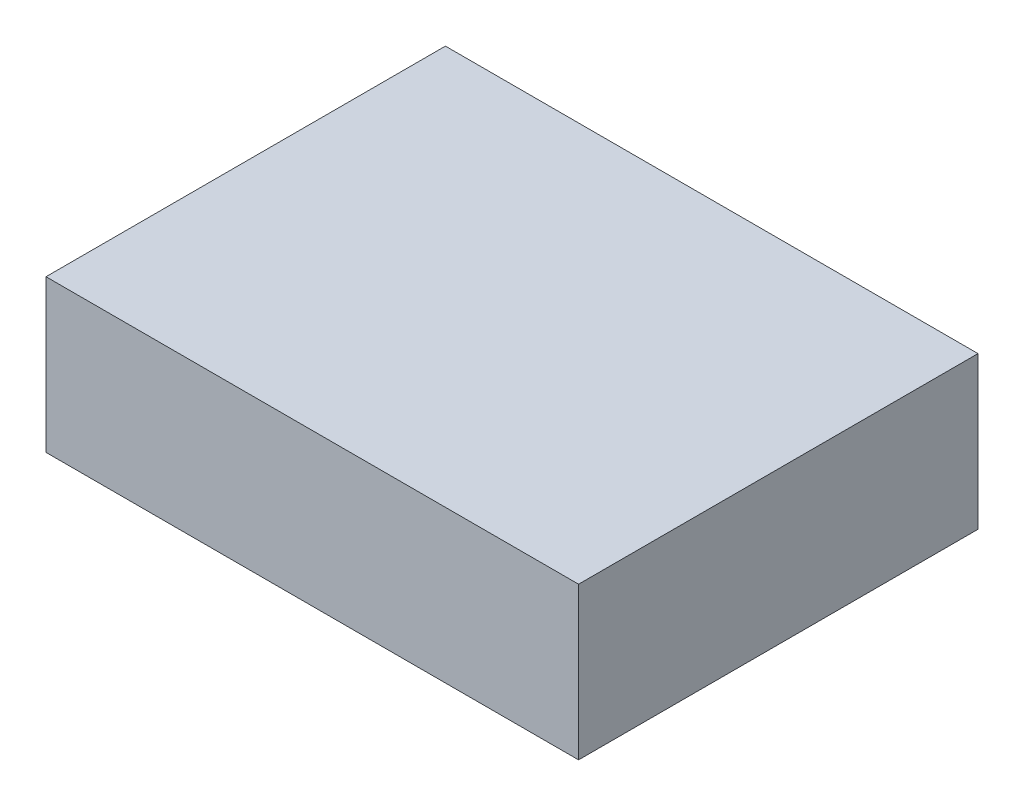
ISO-10303-21;
HEADER;
FILE_DESCRIPTION(('STEP AP214'),'2;1');
FILE_NAME('part.step','',(''),(''),'','','');
FILE_SCHEMA(('AUTOMOTIVE_DESIGN { 1 0 10303 214 1 1 1 1 }'));
ENDSEC;
DATA;
#1=APPLICATION_CONTEXT('core data for automotive mechanical design processes');
#2=APPLICATION_PROTOCOL_DEFINITION('international standard','automotive_design',2000,#1);
#3=PRODUCT_CONTEXT('',#1,'mechanical');
#4=PRODUCT('Part','Part','',(#3));
#5=PRODUCT_RELATED_PRODUCT_CATEGORY('part','',(#4));
#6=PRODUCT_DEFINITION_FORMATION('','',#4);
#7=PRODUCT_DEFINITION_CONTEXT('part definition',#1,'design');
#8=PRODUCT_DEFINITION('design','',#6,#7);
#9=PRODUCT_DEFINITION_SHAPE('','',#8);
#10=(LENGTH_UNIT() NAMED_UNIT(*) SI_UNIT(.MILLI.,.METRE.));
#11=(NAMED_UNIT(*) PLANE_ANGLE_UNIT() SI_UNIT($,.RADIAN.));
#12=(NAMED_UNIT(*) SI_UNIT($,.STERADIAN.) SOLID_ANGLE_UNIT());
#13=UNCERTAINTY_MEASURE_WITH_UNIT(LENGTH_MEASURE(1.E-05),#10,'distance_accuracy_value','');
#14=(GEOMETRIC_REPRESENTATION_CONTEXT(3) GLOBAL_UNCERTAINTY_ASSIGNED_CONTEXT((#13)) GLOBAL_UNIT_ASSIGNED_CONTEXT((#10,
#11,#12)) REPRESENTATION_CONTEXT('',''));
#15=CARTESIAN_POINT('',(0.,0.,0.));
#16=DIRECTION('',(0.,0.,1.));
#17=DIRECTION('',(1.,0.,0.));
#18=AXIS2_PLACEMENT_3D('',#15,#16,#17);
#19=CARTESIAN_POINT('',(0.,25.4,0.));
#20=DIRECTION('',(1.,0.,0.));
#21=DIRECTION('',(0.,0.,-1.));
#22=AXIS2_PLACEMENT_3D('',#19,#20,#21);
#23=PLANE('',#22);
#24=DIRECTION('',(0.,0.,1.));
#25=VECTOR('',#24,1.);
#26=CARTESIAN_POINT('',(0.,0.,0.));
#27=LINE('',#26,#25);
#28=CARTESIAN_POINT('',(0.,0.,-66.675));
#29=VERTEX_POINT('',#28);
#30=CARTESIAN_POINT('',(0.,0.,0.));
#31=VERTEX_POINT('',#30);
#32=EDGE_CURVE('E96',#29,#31,#27,.T.);
#33=ORIENTED_EDGE('',*,*,#32,.T.);
#34=DIRECTION('',(0.,-1.,0.));
#35=VECTOR('',#34,1.);
#36=CARTESIAN_POINT('',(0.,25.4,0.));
#37=LINE('',#36,#35);
#38=CARTESIAN_POINT('',(0.,25.4,0.));
#39=VERTEX_POINT('',#38);
#40=EDGE_CURVE('E11',#39,#31,#37,.T.);
#41=ORIENTED_EDGE('',*,*,#40,.F.);
#42=DIRECTION('',(0.,0.,1.));
#43=VECTOR('',#42,1.);
#44=CARTESIAN_POINT('',(0.,25.4,0.));
#45=LINE('',#44,#43);
#46=CARTESIAN_POINT('',(0.,25.4,-66.675));
#47=VERTEX_POINT('',#46);
#48=EDGE_CURVE('E84',#47,#39,#45,.T.);
#49=ORIENTED_EDGE('',*,*,#48,.F.);
#50=DIRECTION('',(0.,-1.,0.));
#51=VECTOR('',#50,1.);
#52=CARTESIAN_POINT('',(0.,25.4,-66.675));
#53=LINE('',#52,#51);
#54=EDGE_CURVE('E92',#47,#29,#53,.T.);
#55=ORIENTED_EDGE('',*,*,#54,.T.);
#56=EDGE_LOOP('',(#33,#41,#49,#55));
#57=FACE_BOUND('',#56,.T.);
#58=ADVANCED_FACE('F33',(#57),#23,.F.);
#59=CARTESIAN_POINT('',(0.,25.4,0.));
#60=DIRECTION('',(0.,0.,-1.));
#61=DIRECTION('',(-1.,0.,0.));
#62=AXIS2_PLACEMENT_3D('',#59,#60,#61);
#63=PLANE('',#62);
#64=DIRECTION('',(1.,0.,0.));
#65=VECTOR('',#64,1.);
#66=CARTESIAN_POINT('',(0.,0.,0.));
#67=LINE('',#66,#65);
#68=CARTESIAN_POINT('',(88.9,0.,0.));
#69=VERTEX_POINT('',#68);
#70=EDGE_CURVE('E88',#31,#69,#67,.T.);
#71=ORIENTED_EDGE('',*,*,#70,.T.);
#72=DIRECTION('',(0.,-1.,0.));
#73=VECTOR('',#72,1.);
#74=CARTESIAN_POINT('',(88.9,25.4,0.));
#75=LINE('',#74,#73);
#76=CARTESIAN_POINT('',(88.9,25.4,0.));
#77=VERTEX_POINT('',#76);
#78=EDGE_CURVE('E41',#77,#69,#75,.T.);
#79=ORIENTED_EDGE('',*,*,#78,.F.);
#80=DIRECTION('',(1.,0.,0.));
#81=VECTOR('',#80,1.);
#82=CARTESIAN_POINT('',(0.,25.4,0.));
#83=LINE('',#82,#81);
#84=EDGE_CURVE('E79',#39,#77,#83,.T.);
#85=ORIENTED_EDGE('',*,*,#84,.F.);
#86=ORIENTED_EDGE('',*,*,#40,.T.);
#87=EDGE_LOOP('',(#71,#79,#85,#86));
#88=FACE_BOUND('',#87,.T.);
#89=ADVANCED_FACE('F87',(#88),#63,.F.);
#90=CARTESIAN_POINT('',(88.9,25.4,0.));
#91=DIRECTION('',(-1.,0.,0.));
#92=DIRECTION('',(0.,0.,1.));
#93=AXIS2_PLACEMENT_3D('',#90,#91,#92);
#94=PLANE('',#93);
#95=DIRECTION('',(0.,0.,-1.));
#96=VECTOR('',#95,1.);
#97=CARTESIAN_POINT('',(88.9,0.,0.));
#98=LINE('',#97,#96);
#99=CARTESIAN_POINT('',(88.9,0.,-66.675));
#100=VERTEX_POINT('',#99);
#101=EDGE_CURVE('E66',#69,#100,#98,.T.);
#102=ORIENTED_EDGE('',*,*,#101,.T.);
#103=DIRECTION('',(0.,-1.,0.));
#104=VECTOR('',#103,1.);
#105=CARTESIAN_POINT('',(88.9,25.4,-66.675));
#106=LINE('',#105,#104);
#107=CARTESIAN_POINT('',(88.9,25.4,-66.675));
#108=VERTEX_POINT('',#107);
#109=EDGE_CURVE('E89',#108,#100,#106,.T.);
#110=ORIENTED_EDGE('',*,*,#109,.F.);
#111=DIRECTION('',(0.,0.,-1.));
#112=VECTOR('',#111,1.);
#113=CARTESIAN_POINT('',(88.9,25.4,0.));
#114=LINE('',#113,#112);
#115=EDGE_CURVE('E82',#77,#108,#114,.T.);
#116=ORIENTED_EDGE('',*,*,#115,.F.);
#117=ORIENTED_EDGE('',*,*,#78,.T.);
#118=EDGE_LOOP('',(#102,#110,#116,#117));
#119=FACE_BOUND('',#118,.T.);
#120=ADVANCED_FACE('F90',(#119),#94,.F.);
#121=CARTESIAN_POINT('',(0.,25.4,-66.675));
#122=DIRECTION('',(0.,0.,1.));
#123=DIRECTION('',(1.,0.,0.));
#124=AXIS2_PLACEMENT_3D('',#121,#122,#123);
#125=PLANE('',#124);
#126=DIRECTION('',(-1.,0.,0.));
#127=VECTOR('',#126,1.);
#128=CARTESIAN_POINT('',(0.,0.,-66.675));
#129=LINE('',#128,#127);
#130=EDGE_CURVE('E72',#100,#29,#129,.T.);
#131=ORIENTED_EDGE('',*,*,#130,.T.);
#132=ORIENTED_EDGE('',*,*,#54,.F.);
#133=DIRECTION('',(-1.,0.,0.));
#134=VECTOR('',#133,1.);
#135=CARTESIAN_POINT('',(0.,25.4,-66.675));
#136=LINE('',#135,#134);
#137=EDGE_CURVE('E49',#108,#47,#136,.T.);
#138=ORIENTED_EDGE('',*,*,#137,.F.);
#139=ORIENTED_EDGE('',*,*,#109,.T.);
#140=EDGE_LOOP('',(#131,#132,#138,#139));
#141=FACE_BOUND('',#140,.T.);
#142=ADVANCED_FACE('F103',(#141),#125,.F.);
#143=CARTESIAN_POINT('',(0.,25.4,0.));
#144=DIRECTION('',(0.,-1.,0.));
#145=DIRECTION('',(0.,0.,-1.));
#146=AXIS2_PLACEMENT_3D('',#143,#144,#145);
#147=PLANE('',#146);
#148=ORIENTED_EDGE('',*,*,#48,.T.);
#149=ORIENTED_EDGE('',*,*,#84,.T.);
#150=ORIENTED_EDGE('',*,*,#115,.T.);
#151=ORIENTED_EDGE('',*,*,#137,.T.);
#152=EDGE_LOOP('',(#148,#149,#150,#151));
#153=FACE_BOUND('',#152,.T.);
#154=ADVANCED_FACE('F80',(#153),#147,.F.);
#155=CARTESIAN_POINT('',(0.,0.,0.));
#156=DIRECTION('',(0.,-1.,0.));
#157=DIRECTION('',(0.,0.,-1.));
#158=AXIS2_PLACEMENT_3D('',#155,#156,#157);
#159=PLANE('',#158);
#160=ORIENTED_EDGE('',*,*,#32,.F.);
#161=ORIENTED_EDGE('',*,*,#130,.F.);
#162=ORIENTED_EDGE('',*,*,#101,.F.);
#163=ORIENTED_EDGE('',*,*,#70,.F.);
#164=EDGE_LOOP('',(#160,#161,#162,#163));
#165=FACE_BOUND('',#164,.T.);
#166=ADVANCED_FACE('F106',(#165),#159,.T.);
#167=CLOSED_SHELL('',(#58,#89,#120,#142,#154,#166));
#168=MANIFOLD_SOLID_BREP('B2',#167);
#169=ADVANCED_BREP_SHAPE_REPRESENTATION('',(#18,#168),#14);
#170=SHAPE_DEFINITION_REPRESENTATION(#9,#169);
ENDSEC;
END-ISO-10303-21;
